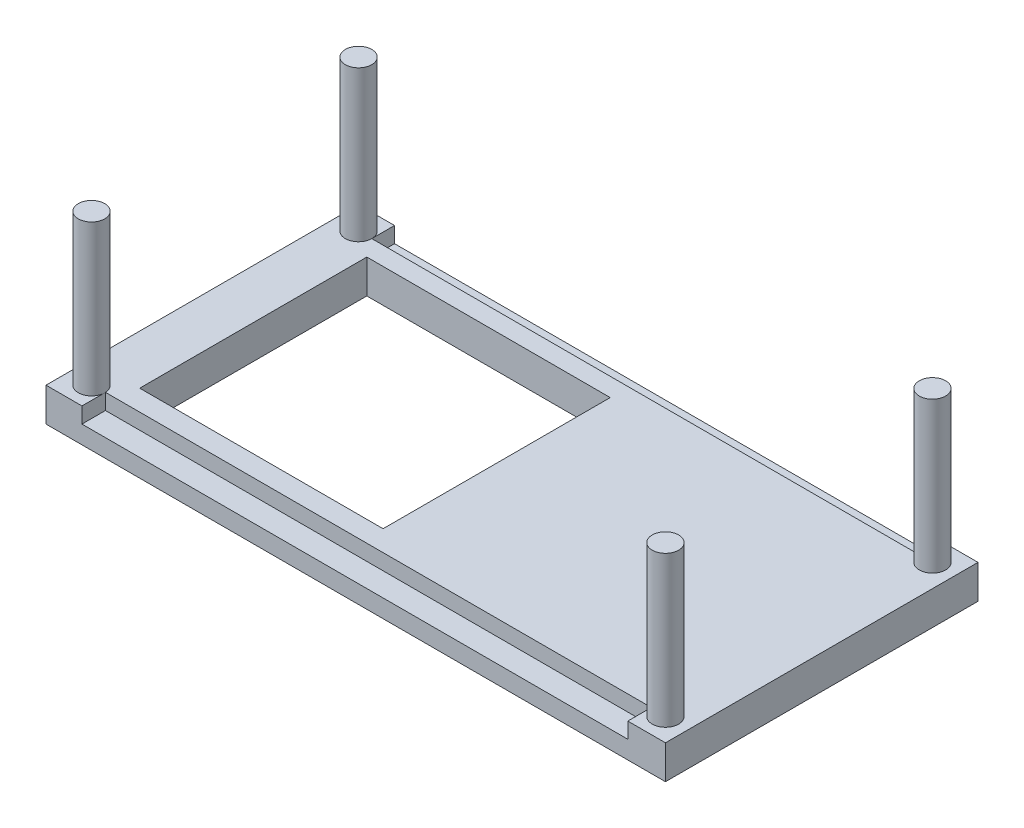
ISO-10303-21;
HEADER;
FILE_DESCRIPTION(('STEP AP214'),'2;1');
FILE_NAME('part.step','',(''),(''),'','','');
FILE_SCHEMA(('AUTOMOTIVE_DESIGN { 1 0 10303 214 1 1 1 1 }'));
ENDSEC;
DATA;
#1=APPLICATION_CONTEXT('core data for automotive mechanical design processes');
#2=APPLICATION_PROTOCOL_DEFINITION('international standard','automotive_design',2000,#1);
#3=PRODUCT_CONTEXT('',#1,'mechanical');
#4=PRODUCT('Part','Part','',(#3));
#5=PRODUCT_RELATED_PRODUCT_CATEGORY('part','',(#4));
#6=PRODUCT_DEFINITION_FORMATION('','',#4);
#7=PRODUCT_DEFINITION_CONTEXT('part definition',#1,'design');
#8=PRODUCT_DEFINITION('design','',#6,#7);
#9=PRODUCT_DEFINITION_SHAPE('','',#8);
#10=(LENGTH_UNIT() NAMED_UNIT(*) SI_UNIT(.MILLI.,.METRE.));
#11=(NAMED_UNIT(*) PLANE_ANGLE_UNIT() SI_UNIT($,.RADIAN.));
#12=(NAMED_UNIT(*) SI_UNIT($,.STERADIAN.) SOLID_ANGLE_UNIT());
#13=UNCERTAINTY_MEASURE_WITH_UNIT(LENGTH_MEASURE(1.E-05),#10,'distance_accuracy_value','');
#14=(GEOMETRIC_REPRESENTATION_CONTEXT(3) GLOBAL_UNCERTAINTY_ASSIGNED_CONTEXT((#13)) GLOBAL_UNIT_ASSIGNED_CONTEXT((#10,
#11,#12)) REPRESENTATION_CONTEXT('',''));
#15=CARTESIAN_POINT('',(0.,0.,0.));
#16=DIRECTION('',(0.,0.,1.));
#17=DIRECTION('',(1.,0.,0.));
#18=AXIS2_PLACEMENT_3D('',#15,#16,#17);
#19=CARTESIAN_POINT('',(0.,3.,0.));
#20=DIRECTION('',(0.,1.,0.));
#21=DIRECTION('',(0.,0.,1.));
#22=AXIS2_PLACEMENT_3D('',#19,#20,#21);
#23=PLANE('',#22);
#24=DIRECTION('',(0.,0.,1.));
#25=VECTOR('',#24,1.);
#26=CARTESIAN_POINT('',(-24.35,3.,-11.875));
#27=LINE('',#26,#25);
#28=CARTESIAN_POINT('',(-24.35,3.,-13.9));
#29=VERTEX_POINT('',#28);
#30=CARTESIAN_POINT('',(-24.35,3.,-11.875));
#31=VERTEX_POINT('',#30);
#32=EDGE_CURVE('E166',#29,#31,#27,.T.);
#33=ORIENTED_EDGE('',*,*,#32,.F.);
#34=DIRECTION('',(-1.,0.,0.));
#35=VECTOR('',#34,1.);
#36=CARTESIAN_POINT('',(27.55,3.,-13.9));
#37=LINE('',#36,#35);
#38=CARTESIAN_POINT('',(-27.55,3.,-13.9));
#39=VERTEX_POINT('',#38);
#40=EDGE_CURVE('E323',#29,#39,#37,.T.);
#41=ORIENTED_EDGE('',*,*,#40,.T.);
#42=DIRECTION('',(0.,0.,1.));
#43=VECTOR('',#42,1.);
#44=CARTESIAN_POINT('',(-27.55,3.,13.9));
#45=LINE('',#44,#43);
#46=CARTESIAN_POINT('',(-27.55,3.,13.9));
#47=VERTEX_POINT('',#46);
#48=EDGE_CURVE('E313',#39,#47,#45,.T.);
#49=ORIENTED_EDGE('',*,*,#48,.T.);
#50=DIRECTION('',(1.,0.,0.));
#51=VECTOR('',#50,1.);
#52=CARTESIAN_POINT('',(27.55,3.,13.9));
#53=LINE('',#52,#51);
#54=CARTESIAN_POINT('',(-24.351877831263,3.,13.9));
#55=VERTEX_POINT('',#54);
#56=EDGE_CURVE('E318',#47,#55,#53,.T.);
#57=ORIENTED_EDGE('',*,*,#56,.T.);
#58=DIRECTION('',(0.,0.,1.));
#59=VECTOR('',#58,1.);
#60=CARTESIAN_POINT('',(-24.351877831263,3.,11.8085968583734));
#61=LINE('',#60,#59);
#62=CARTESIAN_POINT('',(-24.351877831263,3.,11.9414031416266));
#63=VERTEX_POINT('',#62);
#64=EDGE_CURVE('E201',#63,#55,#61,.T.);
#65=ORIENTED_EDGE('',*,*,#64,.F.);
#66=CARTESIAN_POINT('',(-25.525,3.,11.875));
#67=DIRECTION('',(0.,1.,0.));
#68=DIRECTION('',(0.,0.,1.));
#69=AXIS2_PLACEMENT_3D('',#66,#67,#68);
#70=CIRCLE('',#69,1.175);
#71=CARTESIAN_POINT('',(-24.351877831263,3.,11.8085968583734));
#72=VERTEX_POINT('',#71);
#73=EDGE_CURVE('E282',#72,#63,#70,.T.);
#74=ORIENTED_EDGE('',*,*,#73,.F.);
#75=DIRECTION('',(-1.,0.,0.));
#76=VECTOR('',#75,1.);
#77=CARTESIAN_POINT('',(-24.351877831263,3.,11.8085968583734));
#78=LINE('',#77,#76);
#79=CARTESIAN_POINT('',(24.2,3.,11.8085968583734));
#80=VERTEX_POINT('',#79);
#81=EDGE_CURVE('E60',#80,#72,#78,.T.);
#82=ORIENTED_EDGE('',*,*,#81,.F.);
#83=DIRECTION('',(0.,0.,-1.));
#84=VECTOR('',#83,1.);
#85=CARTESIAN_POINT('',(24.2,3.,11.8085968583734));
#86=LINE('',#85,#84);
#87=CARTESIAN_POINT('',(24.2,3.,13.9));
#88=VERTEX_POINT('',#87);
#89=EDGE_CURVE('E198',#88,#80,#86,.T.);
#90=ORIENTED_EDGE('',*,*,#89,.F.);
#91=CARTESIAN_POINT('',(27.55,3.,13.9));
#92=VERTEX_POINT('',#91);
#93=EDGE_CURVE('E316',#88,#92,#53,.T.);
#94=ORIENTED_EDGE('',*,*,#93,.T.);
#95=DIRECTION('',(0.,0.,-1.));
#96=VECTOR('',#95,1.);
#97=CARTESIAN_POINT('',(27.55,3.,13.9));
#98=LINE('',#97,#96);
#99=CARTESIAN_POINT('',(27.55,3.,-13.9));
#100=VERTEX_POINT('',#99);
#101=EDGE_CURVE('E321',#92,#100,#98,.T.);
#102=ORIENTED_EDGE('',*,*,#101,.T.);
#103=CARTESIAN_POINT('',(24.35,3.,-13.9));
#104=VERTEX_POINT('',#103);
#105=EDGE_CURVE('E324',#100,#104,#37,.T.);
#106=ORIENTED_EDGE('',*,*,#105,.T.);
#107=DIRECTION('',(0.,0.,-1.));
#108=VECTOR('',#107,1.);
#109=CARTESIAN_POINT('',(24.35,3.,-11.875));
#110=LINE('',#109,#108);
#111=CARTESIAN_POINT('',(24.35,3.,-11.875));
#112=VERTEX_POINT('',#111);
#113=EDGE_CURVE('E160',#112,#104,#110,.T.);
#114=ORIENTED_EDGE('',*,*,#113,.F.);
#115=CARTESIAN_POINT('',(25.525,3.,-11.875));
#116=DIRECTION('',(0.,1.,0.));
#117=DIRECTION('',(0.,0.,1.));
#118=AXIS2_PLACEMENT_3D('',#115,#116,#117);
#119=CIRCLE('',#118,1.175);
#120=EDGE_CURVE('E294',#112,#112,#119,.T.);
#121=ORIENTED_EDGE('',*,*,#120,.F.);
#122=DIRECTION('',(1.,0.,0.));
#123=VECTOR('',#122,1.);
#124=CARTESIAN_POINT('',(-24.35,3.,-11.875));
#125=LINE('',#124,#123);
#126=EDGE_CURVE('E177',#31,#112,#125,.T.);
#127=ORIENTED_EDGE('',*,*,#126,.F.);
#128=CARTESIAN_POINT('',(-25.525,3.,-11.875));
#129=DIRECTION('',(0.,1.,0.));
#130=DIRECTION('',(0.,0.,1.));
#131=AXIS2_PLACEMENT_3D('',#128,#129,#130);
#132=CIRCLE('',#131,1.175);
#133=EDGE_CURVE('E306',#31,#31,#132,.T.);
#134=ORIENTED_EDGE('',*,*,#133,.F.);
#135=EDGE_LOOP('',(#33,#41,#49,#57,#65,#74,#82,#90,#94,#102,#106,#114,#121,#127,#134));
#136=FACE_BOUND('',#135,.T.);
#137=CARTESIAN_POINT('',(25.525,3.,11.875));
#138=DIRECTION('',(0.,1.,0.));
#139=DIRECTION('',(0.,0.,1.));
#140=AXIS2_PLACEMENT_3D('',#137,#138,#139);
#141=CIRCLE('',#140,1.175);
#142=CARTESIAN_POINT('',(25.525,3.,13.05));
#143=VERTEX_POINT('',#142);
#144=EDGE_CURVE('E301',#143,#143,#141,.T.);
#145=ORIENTED_EDGE('',*,*,#144,.F.);
#146=EDGE_LOOP('',(#145));
#147=FACE_BOUND('',#146,.T.);
#148=DIRECTION('',(1.,0.,0.));
#149=VECTOR('',#148,1.);
#150=CARTESIAN_POINT('',(0.,3.,9.9664839635949));
#151=LINE('',#150,#149);
#152=CARTESIAN_POINT('',(-23.15,3.,9.9664839635949));
#153=VERTEX_POINT('',#152);
#154=CARTESIAN_POINT('',(-1.50000000000001,3.,9.9664839635949));
#155=VERTEX_POINT('',#154);
#156=EDGE_CURVE('E603',#153,#155,#151,.T.);
#157=ORIENTED_EDGE('',*,*,#156,.F.);
#158=DIRECTION('',(0.,0.,-1.));
#159=VECTOR('',#158,1.);
#160=CARTESIAN_POINT('',(-23.15,3.,0.));
#161=LINE('',#160,#159);
#162=CARTESIAN_POINT('',(-23.15,3.,-10.2372755827815));
#163=VERTEX_POINT('',#162);
#164=EDGE_CURVE('E605',#153,#163,#161,.T.);
#165=ORIENTED_EDGE('',*,*,#164,.T.);
#166=DIRECTION('',(1.,0.,0.));
#167=VECTOR('',#166,1.);
#168=CARTESIAN_POINT('',(0.,3.,-10.2372755827815));
#169=LINE('',#168,#167);
#170=CARTESIAN_POINT('',(-1.50000000000001,3.,-10.2372755827815));
#171=VERTEX_POINT('',#170);
#172=EDGE_CURVE('E592',#163,#171,#169,.T.);
#173=ORIENTED_EDGE('',*,*,#172,.T.);
#174=DIRECTION('',(0.,0.,-1.));
#175=VECTOR('',#174,1.);
#176=CARTESIAN_POINT('',(-1.50000000000001,3.,0.));
#177=LINE('',#176,#175);
#178=EDGE_CURVE('E600',#155,#171,#177,.T.);
#179=ORIENTED_EDGE('',*,*,#178,.F.);
#180=EDGE_LOOP('',(#157,#165,#173,#179));
#181=FACE_BOUND('',#180,.T.);
#182=ADVANCED_FACE('F35',(#136,#147,#181),#23,.T.);
#183=CARTESIAN_POINT('',(0.,0.,0.));
#184=DIRECTION('',(0.,1.,0.));
#185=DIRECTION('',(0.,0.,1.));
#186=AXIS2_PLACEMENT_3D('',#183,#184,#185);
#187=PLANE('',#186);
#188=DIRECTION('',(0.,0.,1.));
#189=VECTOR('',#188,1.);
#190=CARTESIAN_POINT('',(-27.55,0.,13.9));
#191=LINE('',#190,#189);
#192=CARTESIAN_POINT('',(-27.55,0.,-13.9));
#193=VERTEX_POINT('',#192);
#194=CARTESIAN_POINT('',(-27.55,0.,13.9));
#195=VERTEX_POINT('',#194);
#196=EDGE_CURVE('E310',#193,#195,#191,.T.);
#197=ORIENTED_EDGE('',*,*,#196,.F.);
#198=DIRECTION('',(-1.,0.,0.));
#199=VECTOR('',#198,1.);
#200=CARTESIAN_POINT('',(27.55,0.,-13.9));
#201=LINE('',#200,#199);
#202=CARTESIAN_POINT('',(27.55,0.,-13.9));
#203=VERTEX_POINT('',#202);
#204=EDGE_CURVE('E317',#203,#193,#201,.T.);
#205=ORIENTED_EDGE('',*,*,#204,.F.);
#206=DIRECTION('',(0.,0.,-1.));
#207=VECTOR('',#206,1.);
#208=CARTESIAN_POINT('',(27.55,0.,13.9));
#209=LINE('',#208,#207);
#210=CARTESIAN_POINT('',(27.55,0.,13.9));
#211=VERTEX_POINT('',#210);
#212=EDGE_CURVE('E332',#211,#203,#209,.T.);
#213=ORIENTED_EDGE('',*,*,#212,.F.);
#214=DIRECTION('',(1.,0.,0.));
#215=VECTOR('',#214,1.);
#216=CARTESIAN_POINT('',(27.55,0.,13.9));
#217=LINE('',#216,#215);
#218=EDGE_CURVE('E330',#195,#211,#217,.T.);
#219=ORIENTED_EDGE('',*,*,#218,.F.);
#220=EDGE_LOOP('',(#197,#205,#213,#219));
#221=FACE_BOUND('',#220,.T.);
#222=DIRECTION('',(0.,0.,1.));
#223=VECTOR('',#222,1.);
#224=CARTESIAN_POINT('',(-23.15,0.,0.));
#225=LINE('',#224,#223);
#226=CARTESIAN_POINT('',(-23.15,0.,-10.2372755827815));
#227=VERTEX_POINT('',#226);
#228=CARTESIAN_POINT('',(-23.15,0.,9.9664839635949));
#229=VERTEX_POINT('',#228);
#230=EDGE_CURVE('E181',#227,#229,#225,.T.);
#231=ORIENTED_EDGE('',*,*,#230,.T.);
#232=DIRECTION('',(-1.,0.,0.));
#233=VECTOR('',#232,1.);
#234=CARTESIAN_POINT('',(0.,0.,9.9664839635949));
#235=LINE('',#234,#233);
#236=CARTESIAN_POINT('',(-1.50000000000001,0.,9.9664839635949));
#237=VERTEX_POINT('',#236);
#238=EDGE_CURVE('E579',#237,#229,#235,.T.);
#239=ORIENTED_EDGE('',*,*,#238,.F.);
#240=DIRECTION('',(0.,0.,1.));
#241=VECTOR('',#240,1.);
#242=CARTESIAN_POINT('',(-1.50000000000001,0.,0.));
#243=LINE('',#242,#241);
#244=CARTESIAN_POINT('',(-1.50000000000001,0.,-10.2372755827815));
#245=VERTEX_POINT('',#244);
#246=EDGE_CURVE('E584',#245,#237,#243,.T.);
#247=ORIENTED_EDGE('',*,*,#246,.F.);
#248=DIRECTION('',(-1.,0.,0.));
#249=VECTOR('',#248,1.);
#250=CARTESIAN_POINT('',(0.,0.,-10.2372755827815));
#251=LINE('',#250,#249);
#252=EDGE_CURVE('E581',#245,#227,#251,.T.);
#253=ORIENTED_EDGE('',*,*,#252,.T.);
#254=EDGE_LOOP('',(#231,#239,#247,#253));
#255=FACE_BOUND('',#254,.T.);
#256=ADVANCED_FACE('F369',(#221,#255),#187,.F.);
#257=CARTESIAN_POINT('',(-27.55,3.,13.9));
#258=DIRECTION('',(1.,0.,0.));
#259=DIRECTION('',(0.,0.,-1.));
#260=AXIS2_PLACEMENT_3D('',#257,#258,#259);
#261=PLANE('',#260);
#262=ORIENTED_EDGE('',*,*,#196,.T.);
#263=DIRECTION('',(0.,-1.,0.));
#264=VECTOR('',#263,1.);
#265=CARTESIAN_POINT('',(-27.55,3.,13.9));
#266=LINE('',#265,#264);
#267=EDGE_CURVE('E343',#47,#195,#266,.T.);
#268=ORIENTED_EDGE('',*,*,#267,.F.);
#269=ORIENTED_EDGE('',*,*,#48,.F.);
#270=DIRECTION('',(0.,-1.,0.));
#271=VECTOR('',#270,1.);
#272=CARTESIAN_POINT('',(-27.55,3.,-13.9));
#273=LINE('',#272,#271);
#274=EDGE_CURVE('E327',#39,#193,#273,.T.);
#275=ORIENTED_EDGE('',*,*,#274,.T.);
#276=EDGE_LOOP('',(#262,#268,#269,#275));
#277=FACE_BOUND('',#276,.T.);
#278=ADVANCED_FACE('F37',(#277),#261,.F.);
#279=CARTESIAN_POINT('',(27.55,3.,13.9));
#280=DIRECTION('',(0.,0.,-1.));
#281=DIRECTION('',(-1.,0.,0.));
#282=AXIS2_PLACEMENT_3D('',#279,#280,#281);
#283=PLANE('',#282);
#284=DIRECTION('',(1.,0.,0.));
#285=VECTOR('',#284,1.);
#286=CARTESIAN_POINT('',(-24.351877831263,1.6,13.9));
#287=LINE('',#286,#285);
#288=CARTESIAN_POINT('',(-24.351877831263,1.6,13.9));
#289=VERTEX_POINT('',#288);
#290=CARTESIAN_POINT('',(24.2,1.6,13.9));
#291=VERTEX_POINT('',#290);
#292=EDGE_CURVE('E186',#289,#291,#287,.T.);
#293=ORIENTED_EDGE('',*,*,#292,.F.);
#294=DIRECTION('',(0.,1.,0.));
#295=VECTOR('',#294,1.);
#296=CARTESIAN_POINT('',(-24.351877831263,1.6,13.9));
#297=LINE('',#296,#295);
#298=EDGE_CURVE('E195',#289,#55,#297,.T.);
#299=ORIENTED_EDGE('',*,*,#298,.T.);
#300=ORIENTED_EDGE('',*,*,#56,.F.);
#301=ORIENTED_EDGE('',*,*,#267,.T.);
#302=ORIENTED_EDGE('',*,*,#218,.T.);
#303=DIRECTION('',(0.,-1.,0.));
#304=VECTOR('',#303,1.);
#305=CARTESIAN_POINT('',(27.55,3.,13.9));
#306=LINE('',#305,#304);
#307=EDGE_CURVE('E340',#92,#211,#306,.T.);
#308=ORIENTED_EDGE('',*,*,#307,.F.);
#309=ORIENTED_EDGE('',*,*,#93,.F.);
#310=DIRECTION('',(0.,1.,0.));
#311=VECTOR('',#310,1.);
#312=CARTESIAN_POINT('',(24.2,1.6,13.9));
#313=LINE('',#312,#311);
#314=EDGE_CURVE('E403',#291,#88,#313,.T.);
#315=ORIENTED_EDGE('',*,*,#314,.F.);
#316=EDGE_LOOP('',(#293,#299,#300,#301,#302,#308,#309,#315));
#317=FACE_BOUND('',#316,.T.);
#318=ADVANCED_FACE('F394',(#317),#283,.F.);
#319=CARTESIAN_POINT('',(27.55,3.,13.9));
#320=DIRECTION('',(-1.,0.,0.));
#321=DIRECTION('',(0.,0.,1.));
#322=AXIS2_PLACEMENT_3D('',#319,#320,#321);
#323=PLANE('',#322);
#324=ORIENTED_EDGE('',*,*,#212,.T.);
#325=DIRECTION('',(0.,-1.,0.));
#326=VECTOR('',#325,1.);
#327=CARTESIAN_POINT('',(27.55,3.,-13.9));
#328=LINE('',#327,#326);
#329=EDGE_CURVE('E337',#100,#203,#328,.T.);
#330=ORIENTED_EDGE('',*,*,#329,.F.);
#331=ORIENTED_EDGE('',*,*,#101,.F.);
#332=ORIENTED_EDGE('',*,*,#307,.T.);
#333=EDGE_LOOP('',(#324,#330,#331,#332));
#334=FACE_BOUND('',#333,.T.);
#335=ADVANCED_FACE('F363',(#334),#323,.F.);
#336=CARTESIAN_POINT('',(27.55,3.,-13.9));
#337=DIRECTION('',(0.,0.,1.));
#338=DIRECTION('',(1.,0.,0.));
#339=AXIS2_PLACEMENT_3D('',#336,#337,#338);
#340=PLANE('',#339);
#341=ORIENTED_EDGE('',*,*,#40,.F.);
#342=DIRECTION('',(0.,-1.,0.));
#343=VECTOR('',#342,1.);
#344=CARTESIAN_POINT('',(-24.35,3.,-13.9));
#345=LINE('',#344,#343);
#346=CARTESIAN_POINT('',(-24.35,1.6,-13.9));
#347=VERTEX_POINT('',#346);
#348=EDGE_CURVE('E11',#29,#347,#345,.T.);
#349=ORIENTED_EDGE('',*,*,#348,.T.);
#350=DIRECTION('',(1.,0.,0.));
#351=VECTOR('',#350,1.);
#352=CARTESIAN_POINT('',(27.55,1.6,-13.9));
#353=LINE('',#352,#351);
#354=CARTESIAN_POINT('',(24.35,1.6,-13.9));
#355=VERTEX_POINT('',#354);
#356=EDGE_CURVE('E158',#347,#355,#353,.T.);
#357=ORIENTED_EDGE('',*,*,#356,.T.);
#358=DIRECTION('',(0.,1.,0.));
#359=VECTOR('',#358,1.);
#360=CARTESIAN_POINT('',(24.35,3.,-13.9));
#361=LINE('',#360,#359);
#362=EDGE_CURVE('E44',#355,#104,#361,.T.);
#363=ORIENTED_EDGE('',*,*,#362,.T.);
#364=ORIENTED_EDGE('',*,*,#105,.F.);
#365=ORIENTED_EDGE('',*,*,#329,.T.);
#366=ORIENTED_EDGE('',*,*,#204,.T.);
#367=ORIENTED_EDGE('',*,*,#274,.F.);
#368=EDGE_LOOP('',(#341,#349,#357,#363,#364,#365,#366,#367));
#369=FACE_BOUND('',#368,.T.);
#370=ADVANCED_FACE('F351',(#369),#340,.F.);
#371=CARTESIAN_POINT('',(-25.525,16.4,-11.875));
#372=DIRECTION('',(0.,-1.,0.));
#373=DIRECTION('',(0.,0.,-1.));
#374=AXIS2_PLACEMENT_3D('',#371,#372,#373);
#375=CYLINDRICAL_SURFACE('',#374,1.175);
#376=CARTESIAN_POINT('',(-25.525,16.4,-11.875));
#377=DIRECTION('',(0.,1.,0.));
#378=DIRECTION('',(0.,0.,1.));
#379=AXIS2_PLACEMENT_3D('',#376,#377,#378);
#380=CIRCLE('',#379,1.175);
#381=CARTESIAN_POINT('',(-25.525,16.4,-10.7));
#382=VERTEX_POINT('',#381);
#383=EDGE_CURVE('E307',#382,#382,#380,.T.);
#384=ORIENTED_EDGE('',*,*,#383,.F.);
#385=EDGE_LOOP('',(#384));
#386=FACE_BOUND('',#385,.T.);
#387=ORIENTED_EDGE('',*,*,#133,.T.);
#388=EDGE_LOOP('',(#387));
#389=FACE_BOUND('',#388,.T.);
#390=ADVANCED_FACE('F376',(#386,#389),#375,.T.);
#391=CARTESIAN_POINT('',(0.,16.4,0.));
#392=DIRECTION('',(0.,1.,0.));
#393=DIRECTION('',(0.,0.,1.));
#394=AXIS2_PLACEMENT_3D('',#391,#392,#393);
#395=PLANE('',#394);
#396=ORIENTED_EDGE('',*,*,#383,.T.);
#397=EDGE_LOOP('',(#396));
#398=FACE_BOUND('',#397,.T.);
#399=ADVANCED_FACE('F275',(#398),#395,.T.);
#400=CARTESIAN_POINT('',(-25.525,16.4,11.875));
#401=DIRECTION('',(0.,-1.,0.));
#402=DIRECTION('',(0.,0.,-1.));
#403=AXIS2_PLACEMENT_3D('',#400,#401,#402);
#404=CYLINDRICAL_SURFACE('',#403,1.175);
#405=CARTESIAN_POINT('',(-25.525,16.4,11.875));
#406=DIRECTION('',(0.,1.,0.));
#407=DIRECTION('',(0.,0.,1.));
#408=AXIS2_PLACEMENT_3D('',#405,#406,#407);
#409=CIRCLE('',#408,1.175);
#410=CARTESIAN_POINT('',(-25.525,16.4,13.05));
#411=VERTEX_POINT('',#410);
#412=EDGE_CURVE('E292',#411,#411,#409,.T.);
#413=ORIENTED_EDGE('',*,*,#412,.F.);
#414=EDGE_LOOP('',(#413));
#415=FACE_BOUND('',#414,.T.);
#416=CARTESIAN_POINT('',(-25.525,3.,11.875));
#417=DIRECTION('',(0.,1.,0.));
#418=DIRECTION('',(0.998401845733585,0.,0.056513312022667));
#419=AXIS2_PLACEMENT_3D('',#416,#417,#418);
#420=CIRCLE('',#419,1.175);
#421=EDGE_CURVE('E215',#63,#72,#420,.T.);
#422=ORIENTED_EDGE('',*,*,#421,.T.);
#423=ORIENTED_EDGE('',*,*,#73,.T.);
#424=EDGE_LOOP('',(#422,#423));
#425=FACE_BOUND('',#424,.T.);
#426=ADVANCED_FACE('F270',(#415,#425),#404,.T.);
#427=CARTESIAN_POINT('',(0.,16.4,0.));
#428=DIRECTION('',(0.,1.,0.));
#429=DIRECTION('',(0.,0.,1.));
#430=AXIS2_PLACEMENT_3D('',#427,#428,#429);
#431=PLANE('',#430);
#432=ORIENTED_EDGE('',*,*,#412,.T.);
#433=EDGE_LOOP('',(#432));
#434=FACE_BOUND('',#433,.T.);
#435=ADVANCED_FACE('F266',(#434),#431,.T.);
#436=CARTESIAN_POINT('',(25.525,16.4,-11.875));
#437=DIRECTION('',(0.,-1.,0.));
#438=DIRECTION('',(0.,0.,-1.));
#439=AXIS2_PLACEMENT_3D('',#436,#437,#438);
#440=CYLINDRICAL_SURFACE('',#439,1.175);
#441=CARTESIAN_POINT('',(25.525,16.4,-11.875));
#442=DIRECTION('',(0.,1.,0.));
#443=DIRECTION('',(0.,0.,1.));
#444=AXIS2_PLACEMENT_3D('',#441,#442,#443);
#445=CIRCLE('',#444,1.175);
#446=CARTESIAN_POINT('',(25.525,16.4,-10.7));
#447=VERTEX_POINT('',#446);
#448=EDGE_CURVE('E289',#447,#447,#445,.T.);
#449=ORIENTED_EDGE('',*,*,#448,.F.);
#450=EDGE_LOOP('',(#449));
#451=FACE_BOUND('',#450,.T.);
#452=ORIENTED_EDGE('',*,*,#120,.T.);
#453=EDGE_LOOP('',(#452));
#454=FACE_BOUND('',#453,.T.);
#455=ADVANCED_FACE('F262',(#451,#454),#440,.T.);
#456=CARTESIAN_POINT('',(0.,16.4,0.));
#457=DIRECTION('',(0.,1.,0.));
#458=DIRECTION('',(0.,0.,1.));
#459=AXIS2_PLACEMENT_3D('',#456,#457,#458);
#460=PLANE('',#459);
#461=ORIENTED_EDGE('',*,*,#448,.T.);
#462=EDGE_LOOP('',(#461));
#463=FACE_BOUND('',#462,.T.);
#464=ADVANCED_FACE('F258',(#463),#460,.T.);
#465=CARTESIAN_POINT('',(25.525,16.4,11.875));
#466=DIRECTION('',(0.,-1.,0.));
#467=DIRECTION('',(0.,0.,-1.));
#468=AXIS2_PLACEMENT_3D('',#465,#466,#467);
#469=CYLINDRICAL_SURFACE('',#468,1.175);
#470=CARTESIAN_POINT('',(25.525,16.4,11.875));
#471=DIRECTION('',(0.,1.,0.));
#472=DIRECTION('',(0.,0.,1.));
#473=AXIS2_PLACEMENT_3D('',#470,#471,#472);
#474=CIRCLE('',#473,1.175);
#475=CARTESIAN_POINT('',(25.525,16.4,13.05));
#476=VERTEX_POINT('',#475);
#477=EDGE_CURVE('E298',#476,#476,#474,.T.);
#478=ORIENTED_EDGE('',*,*,#477,.F.);
#479=EDGE_LOOP('',(#478));
#480=FACE_BOUND('',#479,.T.);
#481=ORIENTED_EDGE('',*,*,#144,.T.);
#482=EDGE_LOOP('',(#481));
#483=FACE_BOUND('',#482,.T.);
#484=ADVANCED_FACE('F254',(#480,#483),#469,.T.);
#485=CARTESIAN_POINT('',(0.,16.4,0.));
#486=DIRECTION('',(0.,1.,0.));
#487=DIRECTION('',(0.,0.,1.));
#488=AXIS2_PLACEMENT_3D('',#485,#486,#487);
#489=PLANE('',#488);
#490=ORIENTED_EDGE('',*,*,#477,.T.);
#491=EDGE_LOOP('',(#490));
#492=FACE_BOUND('',#491,.T.);
#493=ADVANCED_FACE('F250',(#492),#489,.T.);
#494=CARTESIAN_POINT('',(-23.15,16.4,0.));
#495=DIRECTION('',(1.,0.,0.));
#496=DIRECTION('',(0.,0.,-1.));
#497=AXIS2_PLACEMENT_3D('',#494,#495,#496);
#498=PLANE('',#497);
#499=DIRECTION('',(0.,-1.,0.));
#500=VECTOR('',#499,1.);
#501=CARTESIAN_POINT('',(-23.15,16.4,9.9664839635949));
#502=LINE('',#501,#500);
#503=EDGE_CURVE('E590',#153,#229,#502,.T.);
#504=ORIENTED_EDGE('',*,*,#503,.T.);
#505=ORIENTED_EDGE('',*,*,#230,.F.);
#506=DIRECTION('',(0.,-1.,0.));
#507=VECTOR('',#506,1.);
#508=CARTESIAN_POINT('',(-23.15,16.4,-10.2372755827815));
#509=LINE('',#508,#507);
#510=EDGE_CURVE('E589',#163,#227,#509,.T.);
#511=ORIENTED_EDGE('',*,*,#510,.F.);
#512=ORIENTED_EDGE('',*,*,#164,.F.);
#513=EDGE_LOOP('',(#504,#505,#511,#512));
#514=FACE_BOUND('',#513,.T.);
#515=ADVANCED_FACE('F240',(#514),#498,.T.);
#516=CARTESIAN_POINT('',(0.,16.4,9.9664839635949));
#517=DIRECTION('',(0.,0.,1.));
#518=DIRECTION('',(1.,0.,0.));
#519=AXIS2_PLACEMENT_3D('',#516,#517,#518);
#520=PLANE('',#519);
#521=ORIENTED_EDGE('',*,*,#156,.T.);
#522=DIRECTION('',(0.,-1.,0.));
#523=VECTOR('',#522,1.);
#524=CARTESIAN_POINT('',(-1.50000000000001,16.4,9.9664839635949));
#525=LINE('',#524,#523);
#526=EDGE_CURVE('E593',#155,#237,#525,.T.);
#527=ORIENTED_EDGE('',*,*,#526,.T.);
#528=ORIENTED_EDGE('',*,*,#238,.T.);
#529=ORIENTED_EDGE('',*,*,#503,.F.);
#530=EDGE_LOOP('',(#521,#527,#528,#529));
#531=FACE_BOUND('',#530,.T.);
#532=ADVANCED_FACE('F236',(#531),#520,.F.);
#533=CARTESIAN_POINT('',(-1.50000000000001,16.4,0.));
#534=DIRECTION('',(1.,0.,0.));
#535=DIRECTION('',(0.,0.,-1.));
#536=AXIS2_PLACEMENT_3D('',#533,#534,#535);
#537=PLANE('',#536);
#538=ORIENTED_EDGE('',*,*,#178,.T.);
#539=DIRECTION('',(0.,-1.,0.));
#540=VECTOR('',#539,1.);
#541=CARTESIAN_POINT('',(-1.50000000000001,16.4,-10.2372755827815));
#542=LINE('',#541,#540);
#543=EDGE_CURVE('E595',#171,#245,#542,.T.);
#544=ORIENTED_EDGE('',*,*,#543,.T.);
#545=ORIENTED_EDGE('',*,*,#246,.T.);
#546=ORIENTED_EDGE('',*,*,#526,.F.);
#547=EDGE_LOOP('',(#538,#544,#545,#546));
#548=FACE_BOUND('',#547,.T.);
#549=ADVANCED_FACE('F239',(#548),#537,.F.);
#550=CARTESIAN_POINT('',(0.,16.4,-10.2372755827815));
#551=DIRECTION('',(0.,0.,1.));
#552=DIRECTION('',(1.,0.,0.));
#553=AXIS2_PLACEMENT_3D('',#550,#551,#552);
#554=PLANE('',#553);
#555=ORIENTED_EDGE('',*,*,#510,.T.);
#556=ORIENTED_EDGE('',*,*,#252,.F.);
#557=ORIENTED_EDGE('',*,*,#543,.F.);
#558=ORIENTED_EDGE('',*,*,#172,.F.);
#559=EDGE_LOOP('',(#555,#556,#557,#558));
#560=FACE_BOUND('',#559,.T.);
#561=ADVANCED_FACE('F233',(#560),#554,.T.);
#562=CARTESIAN_POINT('',(-24.351877831263,1.6,11.8085968583734));
#563=DIRECTION('',(-1.,0.,0.));
#564=DIRECTION('',(0.,0.,1.));
#565=AXIS2_PLACEMENT_3D('',#562,#563,#564);
#566=PLANE('',#565);
#567=ORIENTED_EDGE('',*,*,#421,.F.);
#568=ORIENTED_EDGE('',*,*,#64,.T.);
#569=ORIENTED_EDGE('',*,*,#298,.F.);
#570=DIRECTION('',(0.,0.,1.));
#571=VECTOR('',#570,1.);
#572=CARTESIAN_POINT('',(-24.351877831263,1.6,11.8085968583734));
#573=LINE('',#572,#571);
#574=CARTESIAN_POINT('',(-24.351877831263,1.6,11.8085968583734));
#575=VERTEX_POINT('',#574);
#576=EDGE_CURVE('E183',#575,#289,#573,.T.);
#577=ORIENTED_EDGE('',*,*,#576,.F.);
#578=DIRECTION('',(0.,1.,0.));
#579=VECTOR('',#578,1.);
#580=CARTESIAN_POINT('',(-24.351877831263,1.6,11.8085968583734));
#581=LINE('',#580,#579);
#582=EDGE_CURVE('E178',#575,#72,#581,.T.);
#583=ORIENTED_EDGE('',*,*,#582,.T.);
#584=EDGE_LOOP('',(#567,#568,#569,#577,#583));
#585=FACE_BOUND('',#584,.T.);
#586=ADVANCED_FACE('F222',(#585),#566,.F.);
#587=CARTESIAN_POINT('',(-24.351877831263,1.6,11.8085968583734));
#588=DIRECTION('',(0.,0.,-1.));
#589=DIRECTION('',(-1.,0.,0.));
#590=AXIS2_PLACEMENT_3D('',#587,#588,#589);
#591=PLANE('',#590);
#592=ORIENTED_EDGE('',*,*,#81,.T.);
#593=ORIENTED_EDGE('',*,*,#582,.F.);
#594=DIRECTION('',(-1.,0.,0.));
#595=VECTOR('',#594,1.);
#596=CARTESIAN_POINT('',(-24.351877831263,1.6,11.8085968583734));
#597=LINE('',#596,#595);
#598=CARTESIAN_POINT('',(24.2,1.6,11.8085968583734));
#599=VERTEX_POINT('',#598);
#600=EDGE_CURVE('E192',#599,#575,#597,.T.);
#601=ORIENTED_EDGE('',*,*,#600,.F.);
#602=DIRECTION('',(0.,1.,0.));
#603=VECTOR('',#602,1.);
#604=CARTESIAN_POINT('',(24.2,1.6,11.8085968583734));
#605=LINE('',#604,#603);
#606=EDGE_CURVE('E206',#599,#80,#605,.T.);
#607=ORIENTED_EDGE('',*,*,#606,.T.);
#608=EDGE_LOOP('',(#592,#593,#601,#607));
#609=FACE_BOUND('',#608,.T.);
#610=ADVANCED_FACE('F232',(#609),#591,.F.);
#611=CARTESIAN_POINT('',(24.2,1.6,11.8085968583734));
#612=DIRECTION('',(1.,0.,0.));
#613=DIRECTION('',(0.,0.,-1.));
#614=AXIS2_PLACEMENT_3D('',#611,#612,#613);
#615=PLANE('',#614);
#616=ORIENTED_EDGE('',*,*,#89,.T.);
#617=ORIENTED_EDGE('',*,*,#606,.F.);
#618=DIRECTION('',(0.,0.,-1.));
#619=VECTOR('',#618,1.);
#620=CARTESIAN_POINT('',(24.2,1.6,11.8085968583734));
#621=LINE('',#620,#619);
#622=EDGE_CURVE('E189',#291,#599,#621,.T.);
#623=ORIENTED_EDGE('',*,*,#622,.F.);
#624=ORIENTED_EDGE('',*,*,#314,.T.);
#625=EDGE_LOOP('',(#616,#617,#623,#624));
#626=FACE_BOUND('',#625,.T.);
#627=ADVANCED_FACE('F234',(#626),#615,.F.);
#628=CARTESIAN_POINT('',(0.,1.6,0.));
#629=DIRECTION('',(0.,1.,0.));
#630=DIRECTION('',(0.,0.,1.));
#631=AXIS2_PLACEMENT_3D('',#628,#629,#630);
#632=PLANE('',#631);
#633=ORIENTED_EDGE('',*,*,#576,.T.);
#634=ORIENTED_EDGE('',*,*,#292,.T.);
#635=ORIENTED_EDGE('',*,*,#622,.T.);
#636=ORIENTED_EDGE('',*,*,#600,.T.);
#637=EDGE_LOOP('',(#633,#634,#635,#636));
#638=FACE_BOUND('',#637,.T.);
#639=ADVANCED_FACE('F405',(#638),#632,.T.);
#640=CARTESIAN_POINT('',(-24.35,1.6,-11.875));
#641=DIRECTION('',(-1.,0.,0.));
#642=DIRECTION('',(0.,0.,1.));
#643=AXIS2_PLACEMENT_3D('',#640,#641,#642);
#644=PLANE('',#643);
#645=ORIENTED_EDGE('',*,*,#32,.T.);
#646=DIRECTION('',(0.,1.,0.));
#647=VECTOR('',#646,1.);
#648=CARTESIAN_POINT('',(-24.35,1.6,-11.875));
#649=LINE('',#648,#647);
#650=CARTESIAN_POINT('',(-24.35,1.6,-11.875));
#651=VERTEX_POINT('',#650);
#652=EDGE_CURVE('E163',#651,#31,#649,.T.);
#653=ORIENTED_EDGE('',*,*,#652,.F.);
#654=DIRECTION('',(0.,0.,1.));
#655=VECTOR('',#654,1.);
#656=CARTESIAN_POINT('',(-24.35,1.6,-11.875));
#657=LINE('',#656,#655);
#658=EDGE_CURVE('E152',#347,#651,#657,.T.);
#659=ORIENTED_EDGE('',*,*,#658,.F.);
#660=ORIENTED_EDGE('',*,*,#348,.F.);
#661=EDGE_LOOP('',(#645,#653,#659,#660));
#662=FACE_BOUND('',#661,.T.);
#663=ADVANCED_FACE('F164',(#662),#644,.F.);
#664=CARTESIAN_POINT('',(24.35,1.6,-11.875));
#665=DIRECTION('',(1.,0.,0.));
#666=DIRECTION('',(0.,0.,-1.));
#667=AXIS2_PLACEMENT_3D('',#664,#665,#666);
#668=PLANE('',#667);
#669=DIRECTION('',(0.,0.,-1.));
#670=VECTOR('',#669,1.);
#671=CARTESIAN_POINT('',(24.35,1.6,-11.875));
#672=LINE('',#671,#670);
#673=CARTESIAN_POINT('',(24.35,1.6,-11.875));
#674=VERTEX_POINT('',#673);
#675=EDGE_CURVE('E52',#674,#355,#672,.T.);
#676=ORIENTED_EDGE('',*,*,#675,.F.);
#677=DIRECTION('',(0.,1.,0.));
#678=VECTOR('',#677,1.);
#679=CARTESIAN_POINT('',(24.35,1.6,-11.875));
#680=LINE('',#679,#678);
#681=EDGE_CURVE('E170',#674,#112,#680,.T.);
#682=ORIENTED_EDGE('',*,*,#681,.T.);
#683=ORIENTED_EDGE('',*,*,#113,.T.);
#684=ORIENTED_EDGE('',*,*,#362,.F.);
#685=EDGE_LOOP('',(#676,#682,#683,#684));
#686=FACE_BOUND('',#685,.T.);
#687=ADVANCED_FACE('F421',(#686),#668,.F.);
#688=CARTESIAN_POINT('',(0.,1.6,0.));
#689=DIRECTION('',(0.,-1.,0.));
#690=DIRECTION('',(0.,0.,-1.));
#691=AXIS2_PLACEMENT_3D('',#688,#689,#690);
#692=PLANE('',#691);
#693=ORIENTED_EDGE('',*,*,#658,.T.);
#694=DIRECTION('',(1.,0.,0.));
#695=VECTOR('',#694,1.);
#696=CARTESIAN_POINT('',(-24.35,1.6,-11.875));
#697=LINE('',#696,#695);
#698=EDGE_CURVE('E156',#651,#674,#697,.T.);
#699=ORIENTED_EDGE('',*,*,#698,.T.);
#700=ORIENTED_EDGE('',*,*,#675,.T.);
#701=ORIENTED_EDGE('',*,*,#356,.F.);
#702=EDGE_LOOP('',(#693,#699,#700,#701));
#703=FACE_BOUND('',#702,.T.);
#704=ADVANCED_FACE('F154',(#703),#692,.F.);
#705=CARTESIAN_POINT('',(-24.35,1.6,-11.875));
#706=DIRECTION('',(0.,0.,1.));
#707=DIRECTION('',(1.,0.,0.));
#708=AXIS2_PLACEMENT_3D('',#705,#706,#707);
#709=PLANE('',#708);
#710=ORIENTED_EDGE('',*,*,#126,.T.);
#711=ORIENTED_EDGE('',*,*,#681,.F.);
#712=ORIENTED_EDGE('',*,*,#698,.F.);
#713=ORIENTED_EDGE('',*,*,#652,.T.);
#714=EDGE_LOOP('',(#710,#711,#712,#713));
#715=FACE_BOUND('',#714,.T.);
#716=ADVANCED_FACE('F172',(#715),#709,.F.);
#717=CLOSED_SHELL('',(#182,#256,#278,#318,#335,#370,#390,#399,#426,#435,#455,#464,#484,#493,
#515,#532,#549,#561,#586,#610,#627,#639,#663,#687,#704,#716));
#718=MANIFOLD_SOLID_BREP('B2',#717);
#719=ADVANCED_BREP_SHAPE_REPRESENTATION('',(#18,#718),#14);
#720=SHAPE_DEFINITION_REPRESENTATION(#9,#719);
ENDSEC;
END-ISO-10303-21;
